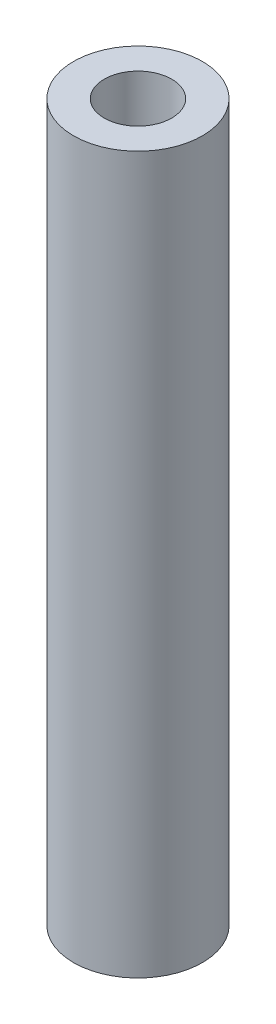
ISO-10303-21;
HEADER;
FILE_DESCRIPTION(('STEP AP214'),'2;1');
FILE_NAME('part.step','',(''),(''),'','','');
FILE_SCHEMA(('AUTOMOTIVE_DESIGN { 1 0 10303 214 1 1 1 1 }'));
ENDSEC;
DATA;
#1=APPLICATION_CONTEXT('core data for automotive mechanical design processes');
#2=APPLICATION_PROTOCOL_DEFINITION('international standard','automotive_design',2000,#1);
#3=PRODUCT_CONTEXT('',#1,'mechanical');
#4=PRODUCT('Part','Part','',(#3));
#5=PRODUCT_RELATED_PRODUCT_CATEGORY('part','',(#4));
#6=PRODUCT_DEFINITION_FORMATION('','',#4);
#7=PRODUCT_DEFINITION_CONTEXT('part definition',#1,'design');
#8=PRODUCT_DEFINITION('design','',#6,#7);
#9=PRODUCT_DEFINITION_SHAPE('','',#8);
#10=(LENGTH_UNIT() NAMED_UNIT(*) SI_UNIT(.MILLI.,.METRE.));
#11=(NAMED_UNIT(*) PLANE_ANGLE_UNIT() SI_UNIT($,.RADIAN.));
#12=(NAMED_UNIT(*) SI_UNIT($,.STERADIAN.) SOLID_ANGLE_UNIT());
#13=UNCERTAINTY_MEASURE_WITH_UNIT(LENGTH_MEASURE(1.E-05),#10,'distance_accuracy_value','');
#14=(GEOMETRIC_REPRESENTATION_CONTEXT(3) GLOBAL_UNCERTAINTY_ASSIGNED_CONTEXT((#13)) GLOBAL_UNIT_ASSIGNED_CONTEXT((#10,
#11,#12)) REPRESENTATION_CONTEXT('',''));
#15=CARTESIAN_POINT('',(0.,0.,0.));
#16=DIRECTION('',(0.,0.,1.));
#17=DIRECTION('',(1.,0.,0.));
#18=AXIS2_PLACEMENT_3D('',#15,#16,#17);
#19=CARTESIAN_POINT('',(0.,35.,0.));
#20=DIRECTION('',(0.,1.,0.));
#21=DIRECTION('',(0.,0.,1.));
#22=AXIS2_PLACEMENT_3D('',#19,#20,#21);
#23=PLANE('',#22);
#24=CARTESIAN_POINT('',(0.,35.,0.));
#25=DIRECTION('',(0.,1.,0.));
#26=DIRECTION('',(0.,0.,1.));
#27=AXIS2_PLACEMENT_3D('',#24,#25,#26);
#28=CIRCLE('',#27,3.15);
#29=CARTESIAN_POINT('',(0.,35.,3.15));
#30=VERTEX_POINT('',#29);
#31=EDGE_CURVE('E10',#30,#30,#28,.T.);
#32=ORIENTED_EDGE('',*,*,#31,.T.);
#33=EDGE_LOOP('',(#32));
#34=FACE_BOUND('',#33,.T.);
#35=CARTESIAN_POINT('',(0.,35.,0.));
#36=DIRECTION('',(0.,1.,0.));
#37=DIRECTION('',(0.,0.,1.));
#38=AXIS2_PLACEMENT_3D('',#35,#36,#37);
#39=CIRCLE('',#38,1.65);
#40=CARTESIAN_POINT('',(0.,35.,1.65));
#41=VERTEX_POINT('',#40);
#42=EDGE_CURVE('E43',#41,#41,#39,.T.);
#43=ORIENTED_EDGE('',*,*,#42,.F.);
#44=EDGE_LOOP('',(#43));
#45=FACE_BOUND('',#44,.T.);
#46=ADVANCED_FACE('F32',(#34,#45),#23,.T.);
#47=CARTESIAN_POINT('',(0.,0.,0.));
#48=DIRECTION('',(0.,1.,0.));
#49=DIRECTION('',(0.,0.,1.));
#50=AXIS2_PLACEMENT_3D('',#47,#48,#49);
#51=PLANE('',#50);
#52=CARTESIAN_POINT('',(0.,0.,0.));
#53=DIRECTION('',(0.,1.,0.));
#54=DIRECTION('',(0.,0.,1.));
#55=AXIS2_PLACEMENT_3D('',#52,#53,#54);
#56=CIRCLE('',#55,3.15);
#57=CARTESIAN_POINT('',(0.,0.,3.15));
#58=VERTEX_POINT('',#57);
#59=EDGE_CURVE('E36',#58,#58,#56,.T.);
#60=ORIENTED_EDGE('',*,*,#59,.F.);
#61=EDGE_LOOP('',(#60));
#62=FACE_BOUND('',#61,.T.);
#63=CARTESIAN_POINT('',(0.,0.,0.));
#64=DIRECTION('',(0.,1.,0.));
#65=DIRECTION('',(0.,0.,1.));
#66=AXIS2_PLACEMENT_3D('',#63,#64,#65);
#67=CIRCLE('',#66,1.65);
#68=CARTESIAN_POINT('',(0.,0.,1.65));
#69=VERTEX_POINT('',#68);
#70=EDGE_CURVE('E45',#69,#69,#67,.T.);
#71=ORIENTED_EDGE('',*,*,#70,.T.);
#72=EDGE_LOOP('',(#71));
#73=FACE_BOUND('',#72,.T.);
#74=ADVANCED_FACE('F55',(#62,#73),#51,.F.);
#75=CARTESIAN_POINT('',(0.,35.,0.));
#76=DIRECTION('',(0.,-1.,0.));
#77=DIRECTION('',(0.,0.,-1.));
#78=AXIS2_PLACEMENT_3D('',#75,#76,#77);
#79=CYLINDRICAL_SURFACE('',#78,3.15);
#80=ORIENTED_EDGE('',*,*,#31,.F.);
#81=EDGE_LOOP('',(#80));
#82=FACE_BOUND('',#81,.T.);
#83=ORIENTED_EDGE('',*,*,#59,.T.);
#84=EDGE_LOOP('',(#83));
#85=FACE_BOUND('',#84,.T.);
#86=ADVANCED_FACE('F34',(#82,#85),#79,.T.);
#87=CARTESIAN_POINT('',(0.,35.,0.));
#88=DIRECTION('',(0.,-1.,0.));
#89=DIRECTION('',(0.,0.,-1.));
#90=AXIS2_PLACEMENT_3D('',#87,#88,#89);
#91=CYLINDRICAL_SURFACE('',#90,1.65);
#92=ORIENTED_EDGE('',*,*,#42,.T.);
#93=EDGE_LOOP('',(#92));
#94=FACE_BOUND('',#93,.T.);
#95=ORIENTED_EDGE('',*,*,#70,.F.);
#96=EDGE_LOOP('',(#95));
#97=FACE_BOUND('',#96,.T.);
#98=ADVANCED_FACE('F51',(#94,#97),#91,.F.);
#99=CLOSED_SHELL('',(#46,#74,#86,#98));
#100=MANIFOLD_SOLID_BREP('B2',#99);
#101=ADVANCED_BREP_SHAPE_REPRESENTATION('',(#18,#100),#14);
#102=SHAPE_DEFINITION_REPRESENTATION(#9,#101);
ENDSEC;
END-ISO-10303-21;
